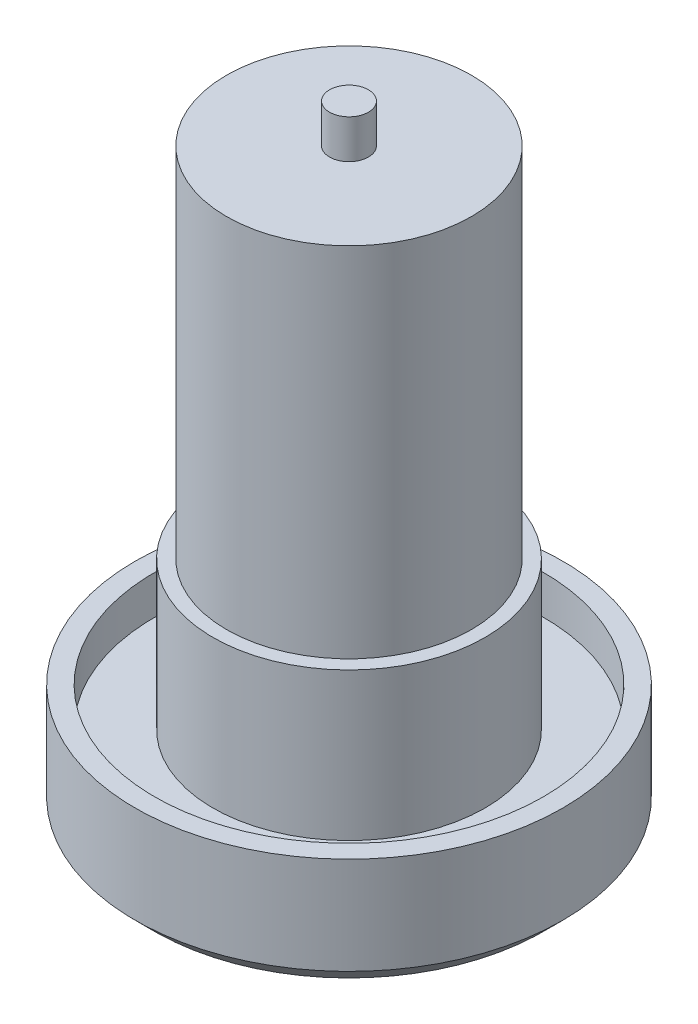
ISO-10303-21;
HEADER;
FILE_DESCRIPTION(('STEP AP214'),'2;1');
FILE_NAME('part.step','',(''),(''),'','','');
FILE_SCHEMA(('AUTOMOTIVE_DESIGN { 1 0 10303 214 1 1 1 1 }'));
ENDSEC;
DATA;
#1=APPLICATION_CONTEXT('core data for automotive mechanical design processes');
#2=APPLICATION_PROTOCOL_DEFINITION('international standard','automotive_design',2000,#1);
#3=PRODUCT_CONTEXT('',#1,'mechanical');
#4=PRODUCT('Part','Part','',(#3));
#5=PRODUCT_RELATED_PRODUCT_CATEGORY('part','',(#4));
#6=PRODUCT_DEFINITION_FORMATION('','',#4);
#7=PRODUCT_DEFINITION_CONTEXT('part definition',#1,'design');
#8=PRODUCT_DEFINITION('design','',#6,#7);
#9=PRODUCT_DEFINITION_SHAPE('','',#8);
#10=(LENGTH_UNIT() NAMED_UNIT(*) SI_UNIT(.MILLI.,.METRE.));
#11=(NAMED_UNIT(*) PLANE_ANGLE_UNIT() SI_UNIT($,.RADIAN.));
#12=(NAMED_UNIT(*) SI_UNIT($,.STERADIAN.) SOLID_ANGLE_UNIT());
#13=UNCERTAINTY_MEASURE_WITH_UNIT(LENGTH_MEASURE(1.E-05),#10,'distance_accuracy_value','');
#14=(GEOMETRIC_REPRESENTATION_CONTEXT(3) GLOBAL_UNCERTAINTY_ASSIGNED_CONTEXT((#13)) GLOBAL_UNIT_ASSIGNED_CONTEXT((#10,
#11,#12)) REPRESENTATION_CONTEXT('',''));
#15=CARTESIAN_POINT('',(0.,0.,0.));
#16=DIRECTION('',(0.,0.,1.));
#17=DIRECTION('',(1.,0.,0.));
#18=AXIS2_PLACEMENT_3D('',#15,#16,#17);
#19=CARTESIAN_POINT('',(0.,-8.,0.));
#20=DIRECTION('',(0.,-1.,0.));
#21=DIRECTION('',(0.,0.,-1.));
#22=AXIS2_PLACEMENT_3D('',#19,#20,#21);
#23=PLANE('',#22);
#24=CARTESIAN_POINT('',(0.,-8.,0.));
#25=DIRECTION('',(0.,1.,0.));
#26=DIRECTION('',(-1.,0.,0.));
#27=AXIS2_PLACEMENT_3D('',#24,#25,#26);
#28=CIRCLE('',#27,0.5);
#29=CARTESIAN_POINT('',(0.5,-8.,0.));
#30=VERTEX_POINT('',#29);
#31=EDGE_CURVE('E28',#30,#30,#28,.T.);
#32=ORIENTED_EDGE('',*,*,#31,.F.);
#33=EDGE_LOOP('',(#32));
#34=FACE_BOUND('',#33,.T.);
#35=ADVANCED_FACE('F17',(#34),#23,.T.);
#36=CARTESIAN_POINT('',(0.,0.8,0.));
#37=DIRECTION('',(0.,-1.,0.));
#38=DIRECTION('',(-1.,0.,0.));
#39=AXIS2_PLACEMENT_3D('',#36,#37,#38);
#40=CYLINDRICAL_SURFACE('',#39,0.5);
#41=ORIENTED_EDGE('',*,*,#31,.T.);
#42=DIRECTION('',(0.,-1.,0.));
#43=VECTOR('',#42,1.);
#44=CARTESIAN_POINT('',(0.5,0.8,0.));
#45=LINE('',#44,#43);
#46=CARTESIAN_POINT('',(0.5,-16.,0.));
#47=VERTEX_POINT('',#46);
#48=EDGE_CURVE('E11',#30,#47,#45,.T.);
#49=ORIENTED_EDGE('',*,*,#48,.T.);
#50=CARTESIAN_POINT('',(0.,-16.,0.));
#51=DIRECTION('',(0.,-1.,0.));
#52=DIRECTION('',(-1.,0.,0.));
#53=AXIS2_PLACEMENT_3D('',#50,#51,#52);
#54=CIRCLE('',#53,0.5);
#55=EDGE_CURVE('E170',#47,#47,#54,.T.);
#56=ORIENTED_EDGE('',*,*,#55,.T.);
#57=ORIENTED_EDGE('',*,*,#48,.F.);
#58=EDGE_LOOP('',(#41,#49,#56,#57));
#59=FACE_BOUND('',#58,.T.);
#60=ADVANCED_FACE('F255',(#59),#40,.F.);
#61=CARTESIAN_POINT('',(0.,-16.,0.));
#62=DIRECTION('',(0.,-1.,0.));
#63=DIRECTION('',(0.,0.,-1.));
#64=AXIS2_PLACEMENT_3D('',#61,#62,#63);
#65=PLANE('',#64);
#66=ORIENTED_EDGE('',*,*,#55,.F.);
#67=EDGE_LOOP('',(#66));
#68=FACE_BOUND('',#67,.T.);
#69=CARTESIAN_POINT('',(0.,-16.,0.));
#70=DIRECTION('',(0.,1.,0.));
#71=DIRECTION('',(-1.,0.,0.));
#72=AXIS2_PLACEMENT_3D('',#69,#70,#71);
#73=CIRCLE('',#72,1.5);
#74=CARTESIAN_POINT('',(1.5,-16.,0.));
#75=VERTEX_POINT('',#74);
#76=EDGE_CURVE('E129',#75,#75,#73,.T.);
#77=ORIENTED_EDGE('',*,*,#76,.F.);
#78=EDGE_LOOP('',(#77));
#79=FACE_BOUND('',#78,.T.);
#80=ADVANCED_FACE('F261',(#68,#79),#65,.T.);
#81=CARTESIAN_POINT('',(0.,0.8,0.));
#82=DIRECTION('',(0.,-1.,0.));
#83=DIRECTION('',(-1.,0.,0.));
#84=AXIS2_PLACEMENT_3D('',#81,#82,#83);
#85=CYLINDRICAL_SURFACE('',#84,1.5);
#86=ORIENTED_EDGE('',*,*,#76,.T.);
#87=DIRECTION('',(0.,1.,0.));
#88=VECTOR('',#87,1.);
#89=CARTESIAN_POINT('',(1.5,0.8,0.));
#90=LINE('',#89,#88);
#91=CARTESIAN_POINT('',(1.5,-14.,0.));
#92=VERTEX_POINT('',#91);
#93=EDGE_CURVE('E109',#75,#92,#90,.T.);
#94=ORIENTED_EDGE('',*,*,#93,.T.);
#95=CARTESIAN_POINT('',(0.,-14.,0.));
#96=DIRECTION('',(0.,-1.,0.));
#97=DIRECTION('',(-1.,0.,0.));
#98=AXIS2_PLACEMENT_3D('',#95,#96,#97);
#99=CIRCLE('',#98,1.5);
#100=EDGE_CURVE('E122',#92,#92,#99,.T.);
#101=ORIENTED_EDGE('',*,*,#100,.T.);
#102=ORIENTED_EDGE('',*,*,#93,.F.);
#103=EDGE_LOOP('',(#86,#94,#101,#102));
#104=FACE_BOUND('',#103,.T.);
#105=ADVANCED_FACE('F266',(#104),#85,.T.);
#106=CARTESIAN_POINT('',(0.,-14.,0.));
#107=DIRECTION('',(0.,-1.,0.));
#108=DIRECTION('',(0.,0.,-1.));
#109=AXIS2_PLACEMENT_3D('',#106,#107,#108);
#110=PLANE('',#109);
#111=ORIENTED_EDGE('',*,*,#100,.F.);
#112=EDGE_LOOP('',(#111));
#113=FACE_BOUND('',#112,.T.);
#114=CARTESIAN_POINT('',(0.,-14.,0.));
#115=DIRECTION('',(0.,1.,0.));
#116=DIRECTION('',(-1.,0.,0.));
#117=AXIS2_PLACEMENT_3D('',#114,#115,#116);
#118=CIRCLE('',#117,3.);
#119=CARTESIAN_POINT('',(3.,-14.,0.));
#120=VERTEX_POINT('',#119);
#121=EDGE_CURVE('E118',#120,#120,#118,.T.);
#122=ORIENTED_EDGE('',*,*,#121,.F.);
#123=EDGE_LOOP('',(#122));
#124=FACE_BOUND('',#123,.T.);
#125=ADVANCED_FACE('F278',(#113,#124),#110,.T.);
#126=CARTESIAN_POINT('',(0.,0.8,0.));
#127=DIRECTION('',(0.,-1.,0.));
#128=DIRECTION('',(-1.,0.,0.));
#129=AXIS2_PLACEMENT_3D('',#126,#127,#128);
#130=CYLINDRICAL_SURFACE('',#129,3.);
#131=ORIENTED_EDGE('',*,*,#121,.T.);
#132=DIRECTION('',(0.,-1.,0.));
#133=VECTOR('',#132,1.);
#134=CARTESIAN_POINT('',(3.,0.8,0.));
#135=LINE('',#134,#133);
#136=CARTESIAN_POINT('',(3.,-16.,0.));
#137=VERTEX_POINT('',#136);
#138=EDGE_CURVE('E115',#120,#137,#135,.T.);
#139=ORIENTED_EDGE('',*,*,#138,.T.);
#140=CARTESIAN_POINT('',(0.,-16.,0.));
#141=DIRECTION('',(0.,-1.,0.));
#142=DIRECTION('',(-1.,0.,0.));
#143=AXIS2_PLACEMENT_3D('',#140,#141,#142);
#144=CIRCLE('',#143,3.);
#145=EDGE_CURVE('E120',#137,#137,#144,.T.);
#146=ORIENTED_EDGE('',*,*,#145,.T.);
#147=ORIENTED_EDGE('',*,*,#138,.F.);
#148=EDGE_LOOP('',(#131,#139,#146,#147));
#149=FACE_BOUND('',#148,.T.);
#150=ADVANCED_FACE('F116',(#149),#130,.F.);
#151=CARTESIAN_POINT('',(0.,-16.,0.));
#152=DIRECTION('',(0.,-1.,0.));
#153=DIRECTION('',(0.,0.,-1.));
#154=AXIS2_PLACEMENT_3D('',#151,#152,#153);
#155=PLANE('',#154);
#156=ORIENTED_EDGE('',*,*,#145,.F.);
#157=EDGE_LOOP('',(#156));
#158=FACE_BOUND('',#157,.T.);
#159=CARTESIAN_POINT('',(0.,-16.,0.));
#160=DIRECTION('',(0.,1.,0.));
#161=DIRECTION('',(-1.,0.,0.));
#162=AXIS2_PLACEMENT_3D('',#159,#160,#161);
#163=CIRCLE('',#162,5.);
#164=CARTESIAN_POINT('',(-5.,-16.,0.));
#165=VERTEX_POINT('',#164);
#166=EDGE_CURVE('E87',#165,#165,#163,.T.);
#167=ORIENTED_EDGE('',*,*,#166,.F.);
#168=EDGE_LOOP('',(#167));
#169=FACE_BOUND('',#168,.T.);
#170=ADVANCED_FACE('F243',(#158,#169),#155,.T.);
#171=CARTESIAN_POINT('',(0.,-15.75,0.));
#172=DIRECTION('',(0.,1.,0.));
#173=DIRECTION('',(1.,0.,0.));
#174=AXIS2_PLACEMENT_3D('',#171,#172,#173);
#175=CONICAL_SURFACE('',#174,5.25,0.785398163397448);
#176=CARTESIAN_POINT('',(0.,-15.5,0.));
#177=DIRECTION('',(0.,1.,0.));
#178=DIRECTION('',(-1.,0.,0.));
#179=AXIS2_PLACEMENT_3D('',#176,#177,#178);
#180=CIRCLE('',#179,5.5);
#181=CARTESIAN_POINT('',(5.5,-15.5,0.));
#182=VERTEX_POINT('',#181);
#183=CARTESIAN_POINT('',(-5.5,-15.5,0.));
#184=VERTEX_POINT('',#183);
#185=EDGE_CURVE('E134',#182,#184,#180,.T.);
#186=ORIENTED_EDGE('',*,*,#185,.F.);
#187=CARTESIAN_POINT('',(0.,-15.5,0.));
#188=DIRECTION('',(0.,1.,0.));
#189=DIRECTION('',(-1.,0.,0.));
#190=AXIS2_PLACEMENT_3D('',#187,#188,#189);
#191=CIRCLE('',#190,5.5);
#192=EDGE_CURVE('E138',#184,#182,#191,.T.);
#193=ORIENTED_EDGE('',*,*,#192,.F.);
#194=DIRECTION('',(0.707106781186548,-0.707106781186548,0.));
#195=VECTOR('',#194,1.);
#196=CARTESIAN_POINT('',(-5.25,-15.75,0.));
#197=LINE('',#196,#195);
#198=EDGE_CURVE('E97',#184,#165,#197,.T.);
#199=ORIENTED_EDGE('',*,*,#198,.T.);
#200=ORIENTED_EDGE('',*,*,#166,.T.);
#201=ORIENTED_EDGE('',*,*,#198,.F.);
#202=EDGE_LOOP('',(#186,#193,#199,#200,#201));
#203=FACE_BOUND('',#202,.T.);
#204=ADVANCED_FACE('F241',(#203),#175,.T.);
#205=CARTESIAN_POINT('',(0.,0.8,0.));
#206=DIRECTION('',(0.,-1.,0.));
#207=DIRECTION('',(-1.,0.,0.));
#208=AXIS2_PLACEMENT_3D('',#205,#206,#207);
#209=CYLINDRICAL_SURFACE('',#208,5.5);
#210=ORIENTED_EDGE('',*,*,#185,.T.);
#211=ORIENTED_EDGE('',*,*,#192,.T.);
#212=DIRECTION('',(0.,1.,0.));
#213=VECTOR('',#212,1.);
#214=CARTESIAN_POINT('',(5.5,0.8,0.));
#215=LINE('',#214,#213);
#216=CARTESIAN_POINT('',(5.5,-13.,0.));
#217=VERTEX_POINT('',#216);
#218=EDGE_CURVE('E178',#182,#217,#215,.T.);
#219=ORIENTED_EDGE('',*,*,#218,.T.);
#220=CARTESIAN_POINT('',(0.,-13.,0.));
#221=DIRECTION('',(0.,-1.,0.));
#222=DIRECTION('',(-1.,0.,0.));
#223=AXIS2_PLACEMENT_3D('',#220,#221,#222);
#224=CIRCLE('',#223,5.5);
#225=EDGE_CURVE('E139',#217,#217,#224,.T.);
#226=ORIENTED_EDGE('',*,*,#225,.T.);
#227=ORIENTED_EDGE('',*,*,#218,.F.);
#228=EDGE_LOOP('',(#210,#211,#219,#226,#227));
#229=FACE_BOUND('',#228,.T.);
#230=ADVANCED_FACE('F19',(#229),#209,.T.);
#231=CARTESIAN_POINT('',(0.,-13.,0.));
#232=DIRECTION('',(0.,-1.,0.));
#233=DIRECTION('',(0.,0.,-1.));
#234=AXIS2_PLACEMENT_3D('',#231,#232,#233);
#235=PLANE('',#234);
#236=CARTESIAN_POINT('',(0.,-13.,0.));
#237=DIRECTION('',(0.,1.,0.));
#238=DIRECTION('',(-1.,0.,0.));
#239=AXIS2_PLACEMENT_3D('',#236,#237,#238);
#240=CIRCLE('',#239,5.);
#241=CARTESIAN_POINT('',(5.,-13.,0.));
#242=VERTEX_POINT('',#241);
#243=EDGE_CURVE('E154',#242,#242,#240,.T.);
#244=ORIENTED_EDGE('',*,*,#243,.F.);
#245=EDGE_LOOP('',(#244));
#246=FACE_BOUND('',#245,.T.);
#247=ORIENTED_EDGE('',*,*,#225,.F.);
#248=EDGE_LOOP('',(#247));
#249=FACE_BOUND('',#248,.T.);
#250=ADVANCED_FACE('F234',(#246,#249),#235,.F.);
#251=CARTESIAN_POINT('',(0.,0.8,0.));
#252=DIRECTION('',(0.,-1.,0.));
#253=DIRECTION('',(-1.,0.,0.));
#254=AXIS2_PLACEMENT_3D('',#251,#252,#253);
#255=CYLINDRICAL_SURFACE('',#254,5.);
#256=ORIENTED_EDGE('',*,*,#243,.T.);
#257=DIRECTION('',(0.,-1.,0.));
#258=VECTOR('',#257,1.);
#259=CARTESIAN_POINT('',(5.,0.8,0.));
#260=LINE('',#259,#258);
#261=CARTESIAN_POINT('',(5.,-14.,0.));
#262=VERTEX_POINT('',#261);
#263=EDGE_CURVE('E150',#242,#262,#260,.T.);
#264=ORIENTED_EDGE('',*,*,#263,.T.);
#265=CARTESIAN_POINT('',(0.,-14.,0.));
#266=DIRECTION('',(0.,-1.,0.));
#267=DIRECTION('',(-1.,0.,0.));
#268=AXIS2_PLACEMENT_3D('',#265,#266,#267);
#269=CIRCLE('',#268,5.);
#270=EDGE_CURVE('E157',#262,#262,#269,.T.);
#271=ORIENTED_EDGE('',*,*,#270,.T.);
#272=ORIENTED_EDGE('',*,*,#263,.F.);
#273=EDGE_LOOP('',(#256,#264,#271,#272));
#274=FACE_BOUND('',#273,.T.);
#275=ADVANCED_FACE('F222',(#274),#255,.F.);
#276=CARTESIAN_POINT('',(0.,-14.,0.));
#277=DIRECTION('',(0.,-1.,0.));
#278=DIRECTION('',(0.,0.,-1.));
#279=AXIS2_PLACEMENT_3D('',#276,#277,#278);
#280=PLANE('',#279);
#281=CARTESIAN_POINT('',(0.,-14.,0.));
#282=DIRECTION('',(0.,1.,0.));
#283=DIRECTION('',(-1.,0.,0.));
#284=AXIS2_PLACEMENT_3D('',#281,#282,#283);
#285=CIRCLE('',#284,3.5);
#286=CARTESIAN_POINT('',(3.5,-14.,0.));
#287=VERTEX_POINT('',#286);
#288=EDGE_CURVE('E144',#287,#287,#285,.T.);
#289=ORIENTED_EDGE('',*,*,#288,.F.);
#290=EDGE_LOOP('',(#289));
#291=FACE_BOUND('',#290,.T.);
#292=ORIENTED_EDGE('',*,*,#270,.F.);
#293=EDGE_LOOP('',(#292));
#294=FACE_BOUND('',#293,.T.);
#295=ADVANCED_FACE('F219',(#291,#294),#280,.F.);
#296=CARTESIAN_POINT('',(0.,0.8,0.));
#297=DIRECTION('',(0.,-1.,0.));
#298=DIRECTION('',(-1.,0.,0.));
#299=AXIS2_PLACEMENT_3D('',#296,#297,#298);
#300=CYLINDRICAL_SURFACE('',#299,3.5);
#301=ORIENTED_EDGE('',*,*,#288,.T.);
#302=DIRECTION('',(0.,1.,0.));
#303=VECTOR('',#302,1.);
#304=CARTESIAN_POINT('',(3.5,0.8,0.));
#305=LINE('',#304,#303);
#306=CARTESIAN_POINT('',(3.5,-10.2,0.));
#307=VERTEX_POINT('',#306);
#308=EDGE_CURVE('E155',#287,#307,#305,.T.);
#309=ORIENTED_EDGE('',*,*,#308,.T.);
#310=CARTESIAN_POINT('',(0.,-10.2,0.));
#311=DIRECTION('',(0.,-1.,0.));
#312=DIRECTION('',(-1.,0.,0.));
#313=AXIS2_PLACEMENT_3D('',#310,#311,#312);
#314=CIRCLE('',#313,3.5);
#315=EDGE_CURVE('E140',#307,#307,#314,.T.);
#316=ORIENTED_EDGE('',*,*,#315,.T.);
#317=ORIENTED_EDGE('',*,*,#308,.F.);
#318=EDGE_LOOP('',(#301,#309,#316,#317));
#319=FACE_BOUND('',#318,.T.);
#320=ADVANCED_FACE('F212',(#319),#300,.T.);
#321=CARTESIAN_POINT('',(0.,-10.2,0.));
#322=DIRECTION('',(0.,-1.,0.));
#323=DIRECTION('',(0.,0.,-1.));
#324=AXIS2_PLACEMENT_3D('',#321,#322,#323);
#325=PLANE('',#324);
#326=CARTESIAN_POINT('',(0.,-10.2,0.));
#327=DIRECTION('',(0.,1.,0.));
#328=DIRECTION('',(-1.,0.,0.));
#329=AXIS2_PLACEMENT_3D('',#326,#327,#328);
#330=CIRCLE('',#329,3.15);
#331=CARTESIAN_POINT('',(3.15,-10.2,0.));
#332=VERTEX_POINT('',#331);
#333=EDGE_CURVE('E148',#332,#332,#330,.T.);
#334=ORIENTED_EDGE('',*,*,#333,.F.);
#335=EDGE_LOOP('',(#334));
#336=FACE_BOUND('',#335,.T.);
#337=ORIENTED_EDGE('',*,*,#315,.F.);
#338=EDGE_LOOP('',(#337));
#339=FACE_BOUND('',#338,.T.);
#340=ADVANCED_FACE('F209',(#336,#339),#325,.F.);
#341=CARTESIAN_POINT('',(0.,0.8,0.));
#342=DIRECTION('',(0.,-1.,0.));
#343=DIRECTION('',(-1.,0.,0.));
#344=AXIS2_PLACEMENT_3D('',#341,#342,#343);
#345=CYLINDRICAL_SURFACE('',#344,3.15);
#346=ORIENTED_EDGE('',*,*,#333,.T.);
#347=DIRECTION('',(0.,1.,0.));
#348=VECTOR('',#347,1.);
#349=CARTESIAN_POINT('',(3.15,0.8,0.));
#350=LINE('',#349,#348);
#351=CARTESIAN_POINT('',(3.15,-1.,0.));
#352=VERTEX_POINT('',#351);
#353=EDGE_CURVE('E58',#332,#352,#350,.T.);
#354=ORIENTED_EDGE('',*,*,#353,.T.);
#355=CARTESIAN_POINT('',(0.,-1.,0.));
#356=DIRECTION('',(0.,-1.,0.));
#357=DIRECTION('',(-1.,0.,0.));
#358=AXIS2_PLACEMENT_3D('',#355,#356,#357);
#359=CIRCLE('',#358,3.15);
#360=EDGE_CURVE('E145',#352,#352,#359,.T.);
#361=ORIENTED_EDGE('',*,*,#360,.T.);
#362=ORIENTED_EDGE('',*,*,#353,.F.);
#363=EDGE_LOOP('',(#346,#354,#361,#362));
#364=FACE_BOUND('',#363,.T.);
#365=ADVANCED_FACE('F207',(#364),#345,.T.);
#366=CARTESIAN_POINT('',(0.,-1.,0.));
#367=DIRECTION('',(0.,-1.,0.));
#368=DIRECTION('',(0.,0.,-1.));
#369=AXIS2_PLACEMENT_3D('',#366,#367,#368);
#370=PLANE('',#369);
#371=CARTESIAN_POINT('',(0.,-1.,0.));
#372=DIRECTION('',(0.,1.,0.));
#373=DIRECTION('',(-1.,0.,0.));
#374=AXIS2_PLACEMENT_3D('',#371,#372,#373);
#375=CIRCLE('',#374,0.5);
#376=CARTESIAN_POINT('',(0.5,-1.,0.));
#377=VERTEX_POINT('',#376);
#378=EDGE_CURVE('E159',#377,#377,#375,.T.);
#379=ORIENTED_EDGE('',*,*,#378,.F.);
#380=EDGE_LOOP('',(#379));
#381=FACE_BOUND('',#380,.T.);
#382=ORIENTED_EDGE('',*,*,#360,.F.);
#383=EDGE_LOOP('',(#382));
#384=FACE_BOUND('',#383,.T.);
#385=ADVANCED_FACE('F283',(#381,#384),#370,.F.);
#386=CARTESIAN_POINT('',(0.,0.8,0.));
#387=DIRECTION('',(0.,-1.,0.));
#388=DIRECTION('',(-1.,0.,0.));
#389=AXIS2_PLACEMENT_3D('',#386,#387,#388);
#390=CYLINDRICAL_SURFACE('',#389,0.5);
#391=ORIENTED_EDGE('',*,*,#378,.T.);
#392=DIRECTION('',(0.,1.,0.));
#393=VECTOR('',#392,1.);
#394=CARTESIAN_POINT('',(0.5,0.8,0.));
#395=LINE('',#394,#393);
#396=CARTESIAN_POINT('',(0.5,0.,0.));
#397=VERTEX_POINT('',#396);
#398=EDGE_CURVE('E149',#377,#397,#395,.T.);
#399=ORIENTED_EDGE('',*,*,#398,.T.);
#400=CARTESIAN_POINT('',(0.,0.,0.));
#401=DIRECTION('',(0.,1.,0.));
#402=DIRECTION('',(-1.,0.,0.));
#403=AXIS2_PLACEMENT_3D('',#400,#401,#402);
#404=CIRCLE('',#403,0.5);
#405=EDGE_CURVE('E21',#397,#397,#404,.T.);
#406=ORIENTED_EDGE('',*,*,#405,.F.);
#407=ORIENTED_EDGE('',*,*,#398,.F.);
#408=EDGE_LOOP('',(#391,#399,#406,#407));
#409=FACE_BOUND('',#408,.T.);
#410=ADVANCED_FACE('F272',(#409),#390,.T.);
#411=CARTESIAN_POINT('',(0.,0.,0.));
#412=DIRECTION('',(0.,-1.,0.));
#413=DIRECTION('',(0.,0.,-1.));
#414=AXIS2_PLACEMENT_3D('',#411,#412,#413);
#415=PLANE('',#414);
#416=ORIENTED_EDGE('',*,*,#405,.T.);
#417=EDGE_LOOP('',(#416));
#418=FACE_BOUND('',#417,.T.);
#419=ADVANCED_FACE('F269',(#418),#415,.F.);
#420=CLOSED_SHELL('',(#35,#60,#80,#105,#125,#150,#170,#204,#230,#250,#275,#295,#320,#340,#365,
#385,#410,#419));
#421=MANIFOLD_SOLID_BREP('B1',#420);
#422=ADVANCED_BREP_SHAPE_REPRESENTATION('',(#18,#421),#14);
#423=SHAPE_DEFINITION_REPRESENTATION(#9,#422);
ENDSEC;
END-ISO-10303-21;
